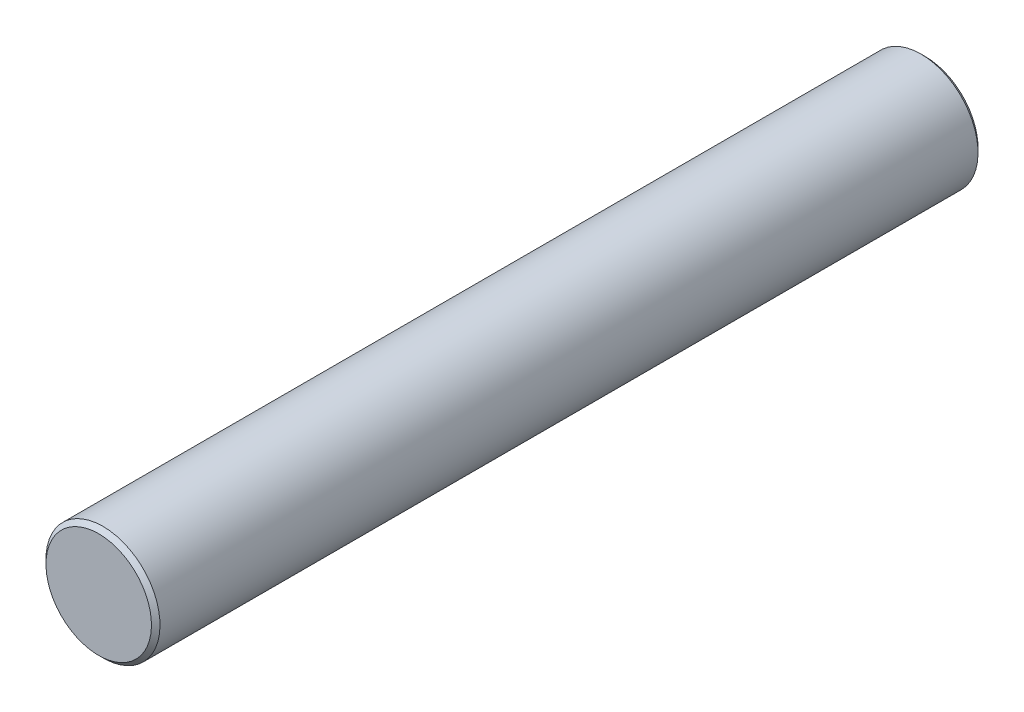
ISO-10303-21;
HEADER;
FILE_DESCRIPTION(('STEP AP214'),'2;1');
FILE_NAME('part.step','',(''),(''),'','','');
FILE_SCHEMA(('AUTOMOTIVE_DESIGN { 1 0 10303 214 1 1 1 1 }'));
ENDSEC;
DATA;
#1=APPLICATION_CONTEXT('core data for automotive mechanical design processes');
#2=APPLICATION_PROTOCOL_DEFINITION('international standard','automotive_design',2000,#1);
#3=PRODUCT_CONTEXT('',#1,'mechanical');
#4=PRODUCT('Part','Part','',(#3));
#5=PRODUCT_RELATED_PRODUCT_CATEGORY('part','',(#4));
#6=PRODUCT_DEFINITION_FORMATION('','',#4);
#7=PRODUCT_DEFINITION_CONTEXT('part definition',#1,'design');
#8=PRODUCT_DEFINITION('design','',#6,#7);
#9=PRODUCT_DEFINITION_SHAPE('','',#8);
#10=(LENGTH_UNIT() NAMED_UNIT(*) SI_UNIT(.MILLI.,.METRE.));
#11=(NAMED_UNIT(*) PLANE_ANGLE_UNIT() SI_UNIT($,.RADIAN.));
#12=(NAMED_UNIT(*) SI_UNIT($,.STERADIAN.) SOLID_ANGLE_UNIT());
#13=UNCERTAINTY_MEASURE_WITH_UNIT(LENGTH_MEASURE(1.E-05),#10,'distance_accuracy_value','');
#14=(GEOMETRIC_REPRESENTATION_CONTEXT(3) GLOBAL_UNCERTAINTY_ASSIGNED_CONTEXT((#13)) GLOBAL_UNIT_ASSIGNED_CONTEXT((#10,
#11,#12)) REPRESENTATION_CONTEXT('',''));
#15=CARTESIAN_POINT('',(0.,0.,0.));
#16=DIRECTION('',(0.,0.,1.));
#17=DIRECTION('',(1.,0.,0.));
#18=AXIS2_PLACEMENT_3D('',#15,#16,#17);
#19=CARTESIAN_POINT('',(0.,9.25,0.));
#20=DIRECTION('',(0.,0.,-1.));
#21=DIRECTION('',(0.,1.,0.));
#22=AXIS2_PLACEMENT_3D('',#19,#20,#21);
#23=PLANE('',#22);
#24=CARTESIAN_POINT('',(0.,0.,0.));
#25=DIRECTION('',(0.,0.,-1.));
#26=DIRECTION('',(0.,1.,0.));
#27=AXIS2_PLACEMENT_3D('',#24,#25,#26);
#28=CIRCLE('',#27,18.5);
#29=CARTESIAN_POINT('',(0.,18.5,0.));
#30=VERTEX_POINT('',#29);
#31=EDGE_CURVE('E9',#30,#30,#28,.T.);
#32=ORIENTED_EDGE('',*,*,#31,.T.);
#33=EDGE_LOOP('',(#32));
#34=FACE_BOUND('',#33,.T.);
#35=CARTESIAN_POINT('',(0.,0.,0.));
#36=DIRECTION('',(0.,0.,1.));
#37=DIRECTION('',(-1.,0.,0.));
#38=AXIS2_PLACEMENT_3D('',#35,#36,#37);
#39=CIRCLE('',#38,6.);
#40=CARTESIAN_POINT('',(-6.,0.,0.));
#41=VERTEX_POINT('',#40);
#42=EDGE_CURVE('E62',#41,#41,#39,.T.);
#43=ORIENTED_EDGE('',*,*,#42,.T.);
#44=EDGE_LOOP('',(#43));
#45=FACE_BOUND('',#44,.T.);
#46=ADVANCED_FACE('F15',(#34,#45),#23,.T.);
#47=CARTESIAN_POINT('',(0.,0.,0.75));
#48=DIRECTION('',(0.,0.,1.));
#49=DIRECTION('',(0.,1.,0.));
#50=AXIS2_PLACEMENT_3D('',#47,#48,#49);
#51=CONICAL_SURFACE('',#50,19.25,0.785398163397448);
#52=CARTESIAN_POINT('',(0.,0.,1.5));
#53=DIRECTION('',(0.,0.,-1.));
#54=DIRECTION('',(0.,1.,0.));
#55=AXIS2_PLACEMENT_3D('',#52,#53,#54);
#56=CIRCLE('',#55,20.);
#57=CARTESIAN_POINT('',(0.,20.,1.5));
#58=VERTEX_POINT('',#57);
#59=EDGE_CURVE('E24',#58,#58,#56,.T.);
#60=ORIENTED_EDGE('',*,*,#59,.T.);
#61=EDGE_LOOP('',(#60));
#62=FACE_BOUND('',#61,.T.);
#63=ORIENTED_EDGE('',*,*,#31,.F.);
#64=EDGE_LOOP('',(#63));
#65=FACE_BOUND('',#64,.T.);
#66=ADVANCED_FACE('F17',(#62,#65),#51,.T.);
#67=CARTESIAN_POINT('',(0.,0.,145.));
#68=DIRECTION('',(0.,0.,1.));
#69=DIRECTION('',(0.,1.,0.));
#70=AXIS2_PLACEMENT_3D('',#67,#68,#69);
#71=CYLINDRICAL_SURFACE('',#70,20.);
#72=CARTESIAN_POINT('',(0.,0.,288.5));
#73=DIRECTION('',(0.,0.,-1.));
#74=DIRECTION('',(0.,1.,0.));
#75=AXIS2_PLACEMENT_3D('',#72,#73,#74);
#76=CIRCLE('',#75,20.);
#77=CARTESIAN_POINT('',(0.,20.,288.5));
#78=VERTEX_POINT('',#77);
#79=EDGE_CURVE('E19',#78,#78,#76,.T.);
#80=ORIENTED_EDGE('',*,*,#79,.T.);
#81=EDGE_LOOP('',(#80));
#82=FACE_BOUND('',#81,.T.);
#83=ORIENTED_EDGE('',*,*,#59,.F.);
#84=EDGE_LOOP('',(#83));
#85=FACE_BOUND('',#84,.T.);
#86=CARTESIAN_POINT('',(0.,0.,6.5));
#87=DIRECTION('',(0.,0.,-1.));
#88=DIRECTION('',(0.,1.,0.));
#89=AXIS2_PLACEMENT_3D('',#86,#87,#88);
#90=CIRCLE('',#89,20.);
#91=CARTESIAN_POINT('',(10.5356537528527,-17.,6.5));
#92=VERTEX_POINT('',#91);
#93=CARTESIAN_POINT('',(-10.5356537528527,-17.,6.5));
#94=VERTEX_POINT('',#93);
#95=EDGE_CURVE('E79',#92,#94,#90,.T.);
#96=ORIENTED_EDGE('',*,*,#95,.T.);
#97=DIRECTION('',(0.,0.,1.));
#98=VECTOR('',#97,1.);
#99=CARTESIAN_POINT('',(-10.5356537528527,-17.,8.25));
#100=LINE('',#99,#98);
#101=CARTESIAN_POINT('',(-10.5356537528527,-17.,10.));
#102=VERTEX_POINT('',#101);
#103=EDGE_CURVE('E71',#94,#102,#100,.T.);
#104=ORIENTED_EDGE('',*,*,#103,.T.);
#105=CARTESIAN_POINT('',(0.,0.,10.));
#106=DIRECTION('',(0.,0.,1.));
#107=DIRECTION('',(0.,1.,0.));
#108=AXIS2_PLACEMENT_3D('',#105,#106,#107);
#109=CIRCLE('',#108,20.);
#110=CARTESIAN_POINT('',(10.5356537528527,-17.,10.));
#111=VERTEX_POINT('',#110);
#112=EDGE_CURVE('E85',#102,#111,#109,.T.);
#113=ORIENTED_EDGE('',*,*,#112,.T.);
#114=DIRECTION('',(0.,0.,-1.));
#115=VECTOR('',#114,1.);
#116=CARTESIAN_POINT('',(10.5356537528527,-17.,8.25));
#117=LINE('',#116,#115);
#118=EDGE_CURVE('E69',#111,#92,#117,.T.);
#119=ORIENTED_EDGE('',*,*,#118,.T.);
#120=EDGE_LOOP('',(#96,#104,#113,#119));
#121=FACE_BOUND('',#120,.T.);
#122=ADVANCED_FACE('F90',(#82,#85,#121),#71,.T.);
#123=CARTESIAN_POINT('',(0.,0.,289.25));
#124=DIRECTION('',(0.,0.,-1.));
#125=DIRECTION('',(0.,1.,0.));
#126=AXIS2_PLACEMENT_3D('',#123,#124,#125);
#127=CONICAL_SURFACE('',#126,19.25,0.785398163397448);
#128=CARTESIAN_POINT('',(0.,0.,290.));
#129=DIRECTION('',(0.,0.,-1.));
#130=DIRECTION('',(0.,1.,0.));
#131=AXIS2_PLACEMENT_3D('',#128,#129,#130);
#132=CIRCLE('',#131,18.5);
#133=CARTESIAN_POINT('',(0.,18.5,290.));
#134=VERTEX_POINT('',#133);
#135=EDGE_CURVE('E57',#134,#134,#132,.T.);
#136=ORIENTED_EDGE('',*,*,#135,.T.);
#137=EDGE_LOOP('',(#136));
#138=FACE_BOUND('',#137,.T.);
#139=ORIENTED_EDGE('',*,*,#79,.F.);
#140=EDGE_LOOP('',(#139));
#141=FACE_BOUND('',#140,.T.);
#142=ADVANCED_FACE('F58',(#138,#141),#127,.T.);
#143=CARTESIAN_POINT('',(0.,9.25,290.));
#144=DIRECTION('',(0.,0.,1.));
#145=DIRECTION('',(0.,-1.,0.));
#146=AXIS2_PLACEMENT_3D('',#143,#144,#145);
#147=PLANE('',#146);
#148=ORIENTED_EDGE('',*,*,#135,.F.);
#149=EDGE_LOOP('',(#148));
#150=FACE_BOUND('',#149,.T.);
#151=ADVANCED_FACE('F116',(#150),#147,.T.);
#152=CARTESIAN_POINT('',(0.,0.,26.4586213285198));
#153=DIRECTION('',(0.,0.,-1.));
#154=DIRECTION('',(-1.,0.,0.));
#155=AXIS2_PLACEMENT_3D('',#152,#153,#154);
#156=CONICAL_SURFACE('',#155,2.52640625,1.0471975511966);
#157=CARTESIAN_POINT('',(0.,0.,25.));
#158=DIRECTION('',(0.,0.,1.));
#159=DIRECTION('',(-1.,0.,0.));
#160=AXIS2_PLACEMENT_3D('',#157,#158,#159);
#161=CIRCLE('',#160,5.0528125);
#162=CARTESIAN_POINT('',(-5.0528125,0.,25.));
#163=VERTEX_POINT('',#162);
#164=EDGE_CURVE('E61',#163,#163,#161,.T.);
#165=ORIENTED_EDGE('',*,*,#164,.F.);
#166=EDGE_LOOP('',(#165));
#167=FACE_BOUND('',#166,.T.);
#168=CARTESIAN_POINT('',(0.,0.,27.9172426570397));
#169=VERTEX_POINT('',#168);
#170=VERTEX_LOOP('',#169);
#171=FACE_BOUND('',#170,.T.);
#172=ADVANCED_FACE('F110',(#167,#171),#156,.F.);
#173=CARTESIAN_POINT('',(0.,0.,12.97359375));
#174=DIRECTION('',(0.,0.,-1.));
#175=DIRECTION('',(-1.,0.,0.));
#176=AXIS2_PLACEMENT_3D('',#173,#174,#175);
#177=CYLINDRICAL_SURFACE('',#176,5.0528125);
#178=CARTESIAN_POINT('',(0.,0.,0.9471875));
#179=DIRECTION('',(0.,0.,1.));
#180=DIRECTION('',(-1.,0.,0.));
#181=AXIS2_PLACEMENT_3D('',#178,#179,#180);
#182=CIRCLE('',#181,5.0528125);
#183=CARTESIAN_POINT('',(-5.0528125,0.,0.9471875));
#184=VERTEX_POINT('',#183);
#185=EDGE_CURVE('E67',#184,#184,#182,.T.);
#186=ORIENTED_EDGE('',*,*,#185,.F.);
#187=EDGE_LOOP('',(#186));
#188=FACE_BOUND('',#187,.T.);
#189=ORIENTED_EDGE('',*,*,#164,.T.);
#190=EDGE_LOOP('',(#189));
#191=FACE_BOUND('',#190,.T.);
#192=ADVANCED_FACE('F104',(#188,#191),#177,.F.);
#193=CARTESIAN_POINT('',(0.,0.,0.47359375));
#194=DIRECTION('',(0.,0.,-1.));
#195=DIRECTION('',(-1.,0.,0.));
#196=AXIS2_PLACEMENT_3D('',#193,#194,#195);
#197=CONICAL_SURFACE('',#196,5.52640625,0.785398163397448);
#198=ORIENTED_EDGE('',*,*,#42,.F.);
#199=EDGE_LOOP('',(#198));
#200=FACE_BOUND('',#199,.T.);
#201=ORIENTED_EDGE('',*,*,#185,.T.);
#202=EDGE_LOOP('',(#201));
#203=FACE_BOUND('',#202,.T.);
#204=ADVANCED_FACE('F100',(#200,#203),#197,.F.);
#205=CARTESIAN_POINT('',(0.,-17.,8.25));
#206=DIRECTION('',(0.,-1.,0.));
#207=DIRECTION('',(0.,0.,-1.));
#208=AXIS2_PLACEMENT_3D('',#205,#206,#207);
#209=PLANE('',#208);
#210=ORIENTED_EDGE('',*,*,#103,.F.);
#211=DIRECTION('',(1.,0.,0.));
#212=VECTOR('',#211,1.);
#213=CARTESIAN_POINT('',(0.,-17.,6.5));
#214=LINE('',#213,#212);
#215=EDGE_CURVE('E76',#94,#92,#214,.T.);
#216=ORIENTED_EDGE('',*,*,#215,.T.);
#217=ORIENTED_EDGE('',*,*,#118,.F.);
#218=DIRECTION('',(-1.,0.,0.));
#219=VECTOR('',#218,1.);
#220=CARTESIAN_POINT('',(0.,-17.,10.));
#221=LINE('',#220,#219);
#222=EDGE_CURVE('E82',#111,#102,#221,.T.);
#223=ORIENTED_EDGE('',*,*,#222,.T.);
#224=EDGE_LOOP('',(#210,#216,#217,#223));
#225=FACE_BOUND('',#224,.T.);
#226=ADVANCED_FACE('F103',(#225),#209,.T.);
#227=CARTESIAN_POINT('',(0.,-19.5,6.5));
#228=DIRECTION('',(0.,0.,1.));
#229=DIRECTION('',(1.,0.,0.));
#230=AXIS2_PLACEMENT_3D('',#227,#228,#229);
#231=PLANE('',#230);
#232=ORIENTED_EDGE('',*,*,#95,.F.);
#233=ORIENTED_EDGE('',*,*,#215,.F.);
#234=EDGE_LOOP('',(#232,#233));
#235=FACE_BOUND('',#234,.T.);
#236=ADVANCED_FACE('F172',(#235),#231,.T.);
#237=CARTESIAN_POINT('',(0.,-19.5,10.));
#238=DIRECTION('',(0.,0.,1.));
#239=DIRECTION('',(1.,0.,0.));
#240=AXIS2_PLACEMENT_3D('',#237,#238,#239);
#241=PLANE('',#240);
#242=ORIENTED_EDGE('',*,*,#112,.F.);
#243=ORIENTED_EDGE('',*,*,#222,.F.);
#244=EDGE_LOOP('',(#242,#243));
#245=FACE_BOUND('',#244,.T.);
#246=ADVANCED_FACE('F94',(#245),#241,.F.);
#247=CLOSED_SHELL('',(#46,#66,#122,#142,#151,#172,#192,#204,#226,#236,#246));
#248=MANIFOLD_SOLID_BREP('B1',#247);
#249=ADVANCED_BREP_SHAPE_REPRESENTATION('',(#18,#248),#14);
#250=SHAPE_DEFINITION_REPRESENTATION(#9,#249);
ENDSEC;
END-ISO-10303-21;
